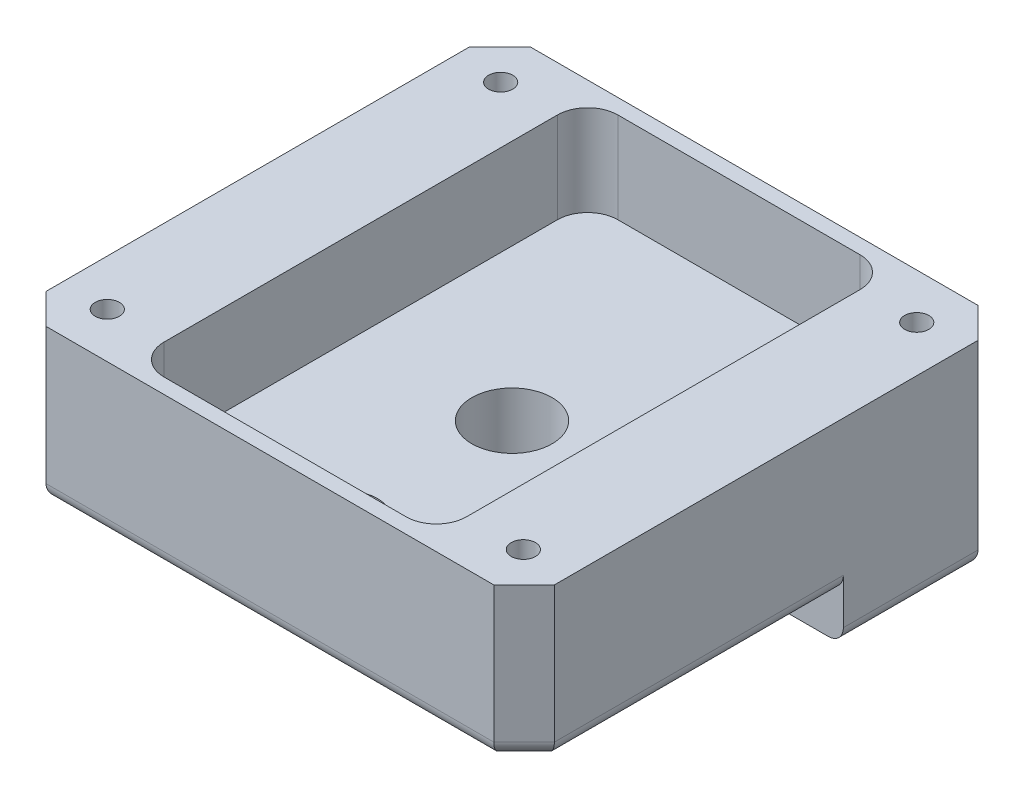
ISO-10303-21;
HEADER;
FILE_DESCRIPTION(('STEP AP214'),'2;1');
FILE_NAME('part.step','',(''),(''),'','','');
FILE_SCHEMA(('AUTOMOTIVE_DESIGN { 1 0 10303 214 1 1 1 1 }'));
ENDSEC;
DATA;
#1=APPLICATION_CONTEXT('core data for automotive mechanical design processes');
#2=APPLICATION_PROTOCOL_DEFINITION('international standard','automotive_design',2000,#1);
#3=PRODUCT_CONTEXT('',#1,'mechanical');
#4=PRODUCT('Part','Part','',(#3));
#5=PRODUCT_RELATED_PRODUCT_CATEGORY('part','',(#4));
#6=PRODUCT_DEFINITION_FORMATION('','',#4);
#7=PRODUCT_DEFINITION_CONTEXT('part definition',#1,'design');
#8=PRODUCT_DEFINITION('design','',#6,#7);
#9=PRODUCT_DEFINITION_SHAPE('','',#8);
#10=(LENGTH_UNIT() NAMED_UNIT(*) SI_UNIT(.MILLI.,.METRE.));
#11=(NAMED_UNIT(*) PLANE_ANGLE_UNIT() SI_UNIT($,.RADIAN.));
#12=(NAMED_UNIT(*) SI_UNIT($,.STERADIAN.) SOLID_ANGLE_UNIT());
#13=UNCERTAINTY_MEASURE_WITH_UNIT(LENGTH_MEASURE(1.E-05),#10,'distance_accuracy_value','');
#14=(GEOMETRIC_REPRESENTATION_CONTEXT(3) GLOBAL_UNCERTAINTY_ASSIGNED_CONTEXT((#13)) GLOBAL_UNIT_ASSIGNED_CONTEXT((#10,
#11,#12)) REPRESENTATION_CONTEXT('',''));
#15=CARTESIAN_POINT('',(0.,0.,0.));
#16=DIRECTION('',(0.,0.,1.));
#17=DIRECTION('',(1.,0.,0.));
#18=AXIS2_PLACEMENT_3D('',#15,#16,#17);
#19=CARTESIAN_POINT('',(-16.8,13.,-16.));
#20=DIRECTION('',(1.,0.,0.));
#21=DIRECTION('',(0.,0.,-1.));
#22=AXIS2_PLACEMENT_3D('',#19,#20,#21);
#23=PLANE('',#22);
#24=DIRECTION('',(0.,-1.,0.));
#25=VECTOR('',#24,1.);
#26=CARTESIAN_POINT('',(-16.8,3.,-5.1));
#27=LINE('',#26,#25);
#28=CARTESIAN_POINT('',(-16.8,4.,-5.1));
#29=VERTEX_POINT('',#28);
#30=CARTESIAN_POINT('',(-16.8,0.999999999999999,-5.1));
#31=VERTEX_POINT('',#30);
#32=EDGE_CURVE('E53',#29,#31,#27,.T.);
#33=ORIENTED_EDGE('',*,*,#32,.F.);
#34=DIRECTION('',(0.,0.,-1.));
#35=VECTOR('',#34,1.);
#36=CARTESIAN_POINT('',(-16.8,4.,-16.));
#37=LINE('',#36,#35);
#38=CARTESIAN_POINT('',(-16.8,4.,14.));
#39=VERTEX_POINT('',#38);
#40=EDGE_CURVE('E382',#29,#39,#37,.F.);
#41=ORIENTED_EDGE('',*,*,#40,.T.);
#42=DIRECTION('',(0.,1.,0.));
#43=VECTOR('',#42,1.);
#44=CARTESIAN_POINT('',(-16.8,13.,14.));
#45=LINE('',#44,#43);
#46=CARTESIAN_POINT('',(-16.8,13.,14.));
#47=VERTEX_POINT('',#46);
#48=EDGE_CURVE('E320',#39,#47,#45,.T.);
#49=ORIENTED_EDGE('',*,*,#48,.T.);
#50=DIRECTION('',(0.,0.,1.));
#51=VECTOR('',#50,1.);
#52=CARTESIAN_POINT('',(-16.8,13.,-16.));
#53=LINE('',#52,#51);
#54=CARTESIAN_POINT('',(-16.8,13.,-14.));
#55=VERTEX_POINT('',#54);
#56=EDGE_CURVE('E250',#55,#47,#53,.T.);
#57=ORIENTED_EDGE('',*,*,#56,.F.);
#58=DIRECTION('',(0.,-1.,0.));
#59=VECTOR('',#58,1.);
#60=CARTESIAN_POINT('',(-16.8,13.,-14.));
#61=LINE('',#60,#59);
#62=CARTESIAN_POINT('',(-16.8,0.999999999999999,-14.));
#63=VERTEX_POINT('',#62);
#64=EDGE_CURVE('E318',#55,#63,#61,.T.);
#65=ORIENTED_EDGE('',*,*,#64,.T.);
#66=DIRECTION('',(0.,0.,1.));
#67=VECTOR('',#66,1.);
#68=CARTESIAN_POINT('',(-16.8,0.999999999999999,-16.));
#69=LINE('',#68,#67);
#70=EDGE_CURVE('E57',#63,#31,#69,.T.);
#71=ORIENTED_EDGE('',*,*,#70,.T.);
#72=EDGE_LOOP('',(#33,#41,#49,#57,#65,#71));
#73=FACE_BOUND('',#72,.T.);
#74=ADVANCED_FACE('F36',(#73),#23,.F.);
#75=CARTESIAN_POINT('',(-16.8,13.,16.));
#76=DIRECTION('',(0.,0.,-1.));
#77=DIRECTION('',(-1.,0.,0.));
#78=AXIS2_PLACEMENT_3D('',#75,#76,#77);
#79=PLANE('',#78);
#80=DIRECTION('',(0.,-1.,0.));
#81=VECTOR('',#80,1.);
#82=CARTESIAN_POINT('',(-14.8,13.,16.));
#83=LINE('',#82,#81);
#84=CARTESIAN_POINT('',(-14.8,13.,16.));
#85=VERTEX_POINT('',#84);
#86=CARTESIAN_POINT('',(-14.8,4.,16.));
#87=VERTEX_POINT('',#86);
#88=EDGE_CURVE('E315',#85,#87,#83,.T.);
#89=ORIENTED_EDGE('',*,*,#88,.T.);
#90=DIRECTION('',(-1.,0.,0.));
#91=VECTOR('',#90,1.);
#92=CARTESIAN_POINT('',(-16.8,4.,16.));
#93=LINE('',#92,#91);
#94=CARTESIAN_POINT('',(14.8,4.,16.));
#95=VERTEX_POINT('',#94);
#96=EDGE_CURVE('E379',#87,#95,#93,.F.);
#97=ORIENTED_EDGE('',*,*,#96,.T.);
#98=DIRECTION('',(0.,1.,0.));
#99=VECTOR('',#98,1.);
#100=CARTESIAN_POINT('',(14.8,13.,16.));
#101=LINE('',#100,#99);
#102=CARTESIAN_POINT('',(14.8,13.,16.));
#103=VERTEX_POINT('',#102);
#104=EDGE_CURVE('E308',#95,#103,#101,.T.);
#105=ORIENTED_EDGE('',*,*,#104,.T.);
#106=DIRECTION('',(1.,0.,0.));
#107=VECTOR('',#106,1.);
#108=CARTESIAN_POINT('',(-16.8,13.,16.));
#109=LINE('',#108,#107);
#110=EDGE_CURVE('E263',#85,#103,#109,.T.);
#111=ORIENTED_EDGE('',*,*,#110,.F.);
#112=EDGE_LOOP('',(#89,#97,#105,#111));
#113=FACE_BOUND('',#112,.T.);
#114=ADVANCED_FACE('F463',(#113),#79,.F.);
#115=CARTESIAN_POINT('',(16.8,13.,-16.));
#116=DIRECTION('',(-1.,0.,0.));
#117=DIRECTION('',(0.,0.,1.));
#118=AXIS2_PLACEMENT_3D('',#115,#116,#117);
#119=PLANE('',#118);
#120=DIRECTION('',(0.,-1.,0.));
#121=VECTOR('',#120,1.);
#122=CARTESIAN_POINT('',(16.8,3.,-5.1));
#123=LINE('',#122,#121);
#124=CARTESIAN_POINT('',(16.8,4.,-5.1));
#125=VERTEX_POINT('',#124);
#126=CARTESIAN_POINT('',(16.8,0.999999999999999,-5.1));
#127=VERTEX_POINT('',#126);
#128=EDGE_CURVE('E313',#125,#127,#123,.T.);
#129=ORIENTED_EDGE('',*,*,#128,.T.);
#130=DIRECTION('',(0.,0.,-1.));
#131=VECTOR('',#130,1.);
#132=CARTESIAN_POINT('',(16.8,0.999999999999999,-16.));
#133=LINE('',#132,#131);
#134=CARTESIAN_POINT('',(16.8,0.999999999999999,-14.));
#135=VERTEX_POINT('',#134);
#136=EDGE_CURVE('E373',#127,#135,#133,.T.);
#137=ORIENTED_EDGE('',*,*,#136,.T.);
#138=DIRECTION('',(0.,1.,0.));
#139=VECTOR('',#138,1.);
#140=CARTESIAN_POINT('',(16.8,13.,-14.));
#141=LINE('',#140,#139);
#142=CARTESIAN_POINT('',(16.8,13.,-14.));
#143=VERTEX_POINT('',#142);
#144=EDGE_CURVE('E330',#135,#143,#141,.T.);
#145=ORIENTED_EDGE('',*,*,#144,.T.);
#146=DIRECTION('',(0.,0.,-1.));
#147=VECTOR('',#146,1.);
#148=CARTESIAN_POINT('',(16.8,13.,-16.));
#149=LINE('',#148,#147);
#150=CARTESIAN_POINT('',(16.8,13.,14.));
#151=VERTEX_POINT('',#150);
#152=EDGE_CURVE('E266',#151,#143,#149,.T.);
#153=ORIENTED_EDGE('',*,*,#152,.F.);
#154=DIRECTION('',(0.,-1.,0.));
#155=VECTOR('',#154,1.);
#156=CARTESIAN_POINT('',(16.8,13.,14.));
#157=LINE('',#156,#155);
#158=CARTESIAN_POINT('',(16.8,4.,14.));
#159=VERTEX_POINT('',#158);
#160=EDGE_CURVE('E332',#151,#159,#157,.T.);
#161=ORIENTED_EDGE('',*,*,#160,.T.);
#162=DIRECTION('',(0.,0.,1.));
#163=VECTOR('',#162,1.);
#164=CARTESIAN_POINT('',(16.8,4.,-16.));
#165=LINE('',#164,#163);
#166=EDGE_CURVE('E370',#159,#125,#165,.F.);
#167=ORIENTED_EDGE('',*,*,#166,.T.);
#168=EDGE_LOOP('',(#129,#137,#145,#153,#161,#167));
#169=FACE_BOUND('',#168,.T.);
#170=ADVANCED_FACE('F468',(#169),#119,.F.);
#171=CARTESIAN_POINT('',(-16.8,13.,-16.));
#172=DIRECTION('',(0.,0.,1.));
#173=DIRECTION('',(1.,0.,0.));
#174=AXIS2_PLACEMENT_3D('',#171,#172,#173);
#175=PLANE('',#174);
#176=DIRECTION('',(0.,-1.,0.));
#177=VECTOR('',#176,1.);
#178=CARTESIAN_POINT('',(14.8,13.,-16.));
#179=LINE('',#178,#177);
#180=CARTESIAN_POINT('',(14.8,13.,-16.));
#181=VERTEX_POINT('',#180);
#182=CARTESIAN_POINT('',(14.8,0.999999999999999,-16.));
#183=VERTEX_POINT('',#182);
#184=EDGE_CURVE('E337',#181,#183,#179,.T.);
#185=ORIENTED_EDGE('',*,*,#184,.T.);
#186=DIRECTION('',(-1.,0.,0.));
#187=VECTOR('',#186,1.);
#188=CARTESIAN_POINT('',(-16.8,0.999999999999999,-16.));
#189=LINE('',#188,#187);
#190=CARTESIAN_POINT('',(-14.8,0.999999999999999,-16.));
#191=VERTEX_POINT('',#190);
#192=EDGE_CURVE('E384',#183,#191,#189,.T.);
#193=ORIENTED_EDGE('',*,*,#192,.T.);
#194=DIRECTION('',(0.,1.,0.));
#195=VECTOR('',#194,1.);
#196=CARTESIAN_POINT('',(-14.8,13.,-16.));
#197=LINE('',#196,#195);
#198=CARTESIAN_POINT('',(-14.8,13.,-16.));
#199=VERTEX_POINT('',#198);
#200=EDGE_CURVE('E335',#191,#199,#197,.T.);
#201=ORIENTED_EDGE('',*,*,#200,.T.);
#202=DIRECTION('',(-1.,0.,0.));
#203=VECTOR('',#202,1.);
#204=CARTESIAN_POINT('',(-16.8,13.,-16.));
#205=LINE('',#204,#203);
#206=EDGE_CURVE('E269',#181,#199,#205,.T.);
#207=ORIENTED_EDGE('',*,*,#206,.F.);
#208=EDGE_LOOP('',(#185,#193,#201,#207));
#209=FACE_BOUND('',#208,.T.);
#210=ADVANCED_FACE('F622',(#209),#175,.F.);
#211=CARTESIAN_POINT('',(0.,13.,0.));
#212=DIRECTION('',(0.,1.,0.));
#213=DIRECTION('',(0.,0.,1.));
#214=AXIS2_PLACEMENT_3D('',#211,#212,#213);
#215=PLANE('',#214);
#216=CARTESIAN_POINT('',(-13.75,13.,-13.));
#217=DIRECTION('',(0.,1.,0.));
#218=DIRECTION('',(0.,0.,1.));
#219=AXIS2_PLACEMENT_3D('',#216,#217,#218);
#220=CIRCLE('',#219,0.799999999999988);
#221=CARTESIAN_POINT('',(-13.75,13.,-12.2));
#222=VERTEX_POINT('',#221);
#223=EDGE_CURVE('E212',#222,#222,#220,.T.);
#224=ORIENTED_EDGE('',*,*,#223,.F.);
#225=EDGE_LOOP('',(#224));
#226=FACE_BOUND('',#225,.T.);
#227=CARTESIAN_POINT('',(13.75,13.,-13.));
#228=DIRECTION('',(0.,1.,0.));
#229=DIRECTION('',(0.,0.,1.));
#230=AXIS2_PLACEMENT_3D('',#227,#228,#229);
#231=CIRCLE('',#230,0.799999999999988);
#232=CARTESIAN_POINT('',(13.75,13.,-12.2));
#233=VERTEX_POINT('',#232);
#234=EDGE_CURVE('E224',#233,#233,#231,.T.);
#235=ORIENTED_EDGE('',*,*,#234,.F.);
#236=EDGE_LOOP('',(#235));
#237=FACE_BOUND('',#236,.T.);
#238=CARTESIAN_POINT('',(13.75,13.,13.));
#239=DIRECTION('',(0.,1.,0.));
#240=DIRECTION('',(0.,0.,1.));
#241=AXIS2_PLACEMENT_3D('',#238,#239,#240);
#242=CIRCLE('',#241,0.799999999999988);
#243=CARTESIAN_POINT('',(13.75,13.,13.8));
#244=VERTEX_POINT('',#243);
#245=EDGE_CURVE('E230',#244,#244,#242,.T.);
#246=ORIENTED_EDGE('',*,*,#245,.F.);
#247=EDGE_LOOP('',(#246));
#248=FACE_BOUND('',#247,.T.);
#249=CARTESIAN_POINT('',(-13.75,13.,13.));
#250=DIRECTION('',(0.,1.,0.));
#251=DIRECTION('',(0.,0.,1.));
#252=AXIS2_PLACEMENT_3D('',#249,#250,#251);
#253=CIRCLE('',#252,0.799999999999988);
#254=CARTESIAN_POINT('',(-13.75,13.,13.8));
#255=VERTEX_POINT('',#254);
#256=EDGE_CURVE('E233',#255,#255,#253,.T.);
#257=ORIENTED_EDGE('',*,*,#256,.F.);
#258=EDGE_LOOP('',(#257));
#259=FACE_BOUND('',#258,.T.);
#260=DIRECTION('',(0.,0.,1.));
#261=VECTOR('',#260,1.);
#262=CARTESIAN_POINT('',(-10.,13.,-15.));
#263=LINE('',#262,#261);
#264=CARTESIAN_POINT('',(-10.,13.,-13.));
#265=VERTEX_POINT('',#264);
#266=CARTESIAN_POINT('',(-10.,13.,13.));
#267=VERTEX_POINT('',#266);
#268=EDGE_CURVE('E236',#265,#267,#263,.T.);
#269=ORIENTED_EDGE('',*,*,#268,.F.);
#270=CARTESIAN_POINT('',(-8.,13.,-13.));
#271=DIRECTION('',(0.,1.,0.));
#272=DIRECTION('',(0.,0.,1.));
#273=AXIS2_PLACEMENT_3D('',#270,#271,#272);
#274=CIRCLE('',#273,2.);
#275=CARTESIAN_POINT('',(-8.,13.,-15.));
#276=VERTEX_POINT('',#275);
#277=EDGE_CURVE('E306',#265,#276,#274,.F.);
#278=ORIENTED_EDGE('',*,*,#277,.T.);
#279=DIRECTION('',(-1.,0.,0.));
#280=VECTOR('',#279,1.);
#281=CARTESIAN_POINT('',(-10.,13.,-15.));
#282=LINE('',#281,#280);
#283=CARTESIAN_POINT('',(8.,13.,-15.));
#284=VERTEX_POINT('',#283);
#285=EDGE_CURVE('E241',#284,#276,#282,.T.);
#286=ORIENTED_EDGE('',*,*,#285,.F.);
#287=CARTESIAN_POINT('',(8.,13.,-13.));
#288=DIRECTION('',(0.,1.,0.));
#289=DIRECTION('',(0.,0.,1.));
#290=AXIS2_PLACEMENT_3D('',#287,#288,#289);
#291=CIRCLE('',#290,2.);
#292=CARTESIAN_POINT('',(10.,13.,-13.));
#293=VERTEX_POINT('',#292);
#294=EDGE_CURVE('E302',#284,#293,#291,.F.);
#295=ORIENTED_EDGE('',*,*,#294,.T.);
#296=DIRECTION('',(0.,0.,-1.));
#297=VECTOR('',#296,1.);
#298=CARTESIAN_POINT('',(10.,13.,-15.));
#299=LINE('',#298,#297);
#300=CARTESIAN_POINT('',(10.,13.,13.));
#301=VERTEX_POINT('',#300);
#302=EDGE_CURVE('E256',#301,#293,#299,.T.);
#303=ORIENTED_EDGE('',*,*,#302,.F.);
#304=CARTESIAN_POINT('',(8.,13.,13.));
#305=DIRECTION('',(0.,1.,0.));
#306=DIRECTION('',(0.,0.,1.));
#307=AXIS2_PLACEMENT_3D('',#304,#305,#306);
#308=CIRCLE('',#307,2.);
#309=CARTESIAN_POINT('',(8.,13.,15.));
#310=VERTEX_POINT('',#309);
#311=EDGE_CURVE('E304',#301,#310,#308,.F.);
#312=ORIENTED_EDGE('',*,*,#311,.T.);
#313=DIRECTION('',(1.,0.,0.));
#314=VECTOR('',#313,1.);
#315=CARTESIAN_POINT('',(-10.,13.,15.));
#316=LINE('',#315,#314);
#317=CARTESIAN_POINT('',(-8.,13.,15.));
#318=VERTEX_POINT('',#317);
#319=EDGE_CURVE('E253',#318,#310,#316,.T.);
#320=ORIENTED_EDGE('',*,*,#319,.F.);
#321=CARTESIAN_POINT('',(-8.,13.,13.));
#322=DIRECTION('',(0.,1.,0.));
#323=DIRECTION('',(0.,0.,1.));
#324=AXIS2_PLACEMENT_3D('',#321,#322,#323);
#325=CIRCLE('',#324,2.);
#326=EDGE_CURVE('E300',#318,#267,#325,.F.);
#327=ORIENTED_EDGE('',*,*,#326,.T.);
#328=EDGE_LOOP('',(#269,#278,#286,#295,#303,#312,#320,#327));
#329=FACE_BOUND('',#328,.T.);
#330=ORIENTED_EDGE('',*,*,#56,.T.);
#331=DIRECTION('',(-0.707106781186546,0.,-0.707106781186549));
#332=VECTOR('',#331,1.);
#333=CARTESIAN_POINT('',(-15.4,13.,15.4));
#334=LINE('',#333,#332);
#335=EDGE_CURVE('E328',#47,#85,#334,.F.);
#336=ORIENTED_EDGE('',*,*,#335,.T.);
#337=ORIENTED_EDGE('',*,*,#110,.T.);
#338=DIRECTION('',(-0.70710678118655,0.,0.707106781186545));
#339=VECTOR('',#338,1.);
#340=CARTESIAN_POINT('',(15.3999999999999,13.,15.4));
#341=LINE('',#340,#339);
#342=EDGE_CURVE('E326',#103,#151,#341,.F.);
#343=ORIENTED_EDGE('',*,*,#342,.T.);
#344=ORIENTED_EDGE('',*,*,#152,.T.);
#345=DIRECTION('',(0.707106781186548,0.,0.707106781186548));
#346=VECTOR('',#345,1.);
#347=CARTESIAN_POINT('',(15.4,13.,-15.4));
#348=LINE('',#347,#346);
#349=EDGE_CURVE('E324',#143,#181,#348,.F.);
#350=ORIENTED_EDGE('',*,*,#349,.T.);
#351=ORIENTED_EDGE('',*,*,#206,.T.);
#352=DIRECTION('',(0.707106781186549,0.,-0.707106781186546));
#353=VECTOR('',#352,1.);
#354=CARTESIAN_POINT('',(-15.4,13.,-15.4));
#355=LINE('',#354,#353);
#356=EDGE_CURVE('E322',#199,#55,#355,.F.);
#357=ORIENTED_EDGE('',*,*,#356,.T.);
#358=EDGE_LOOP('',(#330,#336,#337,#343,#344,#350,#351,#357));
#359=FACE_BOUND('',#358,.T.);
#360=ADVANCED_FACE('F612',(#226,#237,#248,#259,#329,#359),#215,.T.);
#361=CARTESIAN_POINT('',(0.,0.,0.));
#362=DIRECTION('',(0.,1.,0.));
#363=DIRECTION('',(0.,0.,1.));
#364=AXIS2_PLACEMENT_3D('',#361,#362,#363);
#365=PLANE('',#364);
#366=CARTESIAN_POINT('',(-13.75,0.,-13.));
#367=DIRECTION('',(0.,1.,0.));
#368=DIRECTION('',(0.,0.,1.));
#369=AXIS2_PLACEMENT_3D('',#366,#367,#368);
#370=CIRCLE('',#369,0.799999999999997);
#371=CARTESIAN_POINT('',(-13.75,0.,-12.2));
#372=VERTEX_POINT('',#371);
#373=EDGE_CURVE('E221',#372,#372,#370,.T.);
#374=ORIENTED_EDGE('',*,*,#373,.T.);
#375=EDGE_LOOP('',(#374));
#376=FACE_BOUND('',#375,.T.);
#377=CARTESIAN_POINT('',(13.75,0.,-13.));
#378=DIRECTION('',(0.,1.,0.));
#379=DIRECTION('',(0.,0.,1.));
#380=AXIS2_PLACEMENT_3D('',#377,#378,#379);
#381=CIRCLE('',#380,0.799999999999997);
#382=CARTESIAN_POINT('',(13.75,0.,-12.2));
#383=VERTEX_POINT('',#382);
#384=EDGE_CURVE('E227',#383,#383,#381,.T.);
#385=ORIENTED_EDGE('',*,*,#384,.T.);
#386=EDGE_LOOP('',(#385));
#387=FACE_BOUND('',#386,.T.);
#388=DIRECTION('',(-0.707106781186548,0.,-0.707106781186548));
#389=VECTOR('',#388,1.);
#390=CARTESIAN_POINT('',(16.0928932188135,0.,-13.2928932188134));
#391=LINE('',#390,#389);
#392=CARTESIAN_POINT('',(14.3857864376269,0.,-15.));
#393=VERTEX_POINT('',#392);
#394=CARTESIAN_POINT('',(15.8,0.,-13.5857864376269));
#395=VERTEX_POINT('',#394);
#396=EDGE_CURVE('E357',#393,#395,#391,.F.);
#397=ORIENTED_EDGE('',*,*,#396,.T.);
#398=DIRECTION('',(0.,0.,-1.));
#399=VECTOR('',#398,1.);
#400=CARTESIAN_POINT('',(15.8,0.,0.));
#401=LINE('',#400,#399);
#402=CARTESIAN_POINT('',(15.8,0.,-5.1));
#403=VERTEX_POINT('',#402);
#404=EDGE_CURVE('E364',#395,#403,#401,.F.);
#405=ORIENTED_EDGE('',*,*,#404,.T.);
#406=DIRECTION('',(1.,0.,0.));
#407=VECTOR('',#406,1.);
#408=CARTESIAN_POINT('',(-16.8,0.,-5.1));
#409=LINE('',#408,#407);
#410=CARTESIAN_POINT('',(-15.8,0.,-5.1));
#411=VERTEX_POINT('',#410);
#412=EDGE_CURVE('E398',#411,#403,#409,.T.);
#413=ORIENTED_EDGE('',*,*,#412,.F.);
#414=DIRECTION('',(0.,0.,1.));
#415=VECTOR('',#414,1.);
#416=CARTESIAN_POINT('',(-15.8,0.,0.));
#417=LINE('',#416,#415);
#418=CARTESIAN_POINT('',(-15.8,0.,-13.5857864376269));
#419=VERTEX_POINT('',#418);
#420=EDGE_CURVE('E362',#411,#419,#417,.F.);
#421=ORIENTED_EDGE('',*,*,#420,.T.);
#422=DIRECTION('',(-0.707106781186549,0.,0.707106781186546));
#423=VECTOR('',#422,1.);
#424=CARTESIAN_POINT('',(-14.0928932188135,0.,-15.2928932188135));
#425=LINE('',#424,#423);
#426=CARTESIAN_POINT('',(-14.3857864376269,0.,-15.));
#427=VERTEX_POINT('',#426);
#428=EDGE_CURVE('E359',#419,#427,#425,.F.);
#429=ORIENTED_EDGE('',*,*,#428,.T.);
#430=DIRECTION('',(-1.,0.,0.));
#431=VECTOR('',#430,1.);
#432=CARTESIAN_POINT('',(0.,0.,-15.));
#433=LINE('',#432,#431);
#434=EDGE_CURVE('E355',#427,#393,#433,.F.);
#435=ORIENTED_EDGE('',*,*,#434,.T.);
#436=EDGE_LOOP('',(#397,#405,#413,#421,#429,#435));
#437=FACE_BOUND('',#436,.T.);
#438=ADVANCED_FACE('F422',(#376,#387,#437),#365,.F.);
#439=CARTESIAN_POINT('',(-10.,7.,-15.));
#440=DIRECTION('',(-1.,0.,0.));
#441=DIRECTION('',(0.,0.,1.));
#442=AXIS2_PLACEMENT_3D('',#439,#440,#441);
#443=PLANE('',#442);
#444=ORIENTED_EDGE('',*,*,#268,.T.);
#445=DIRECTION('',(0.,1.,0.));
#446=VECTOR('',#445,1.);
#447=CARTESIAN_POINT('',(-10.,7.,13.));
#448=LINE('',#447,#446);
#449=CARTESIAN_POINT('',(-10.,7.,13.));
#450=VERTEX_POINT('',#449);
#451=EDGE_CURVE('E280',#267,#450,#448,.F.);
#452=ORIENTED_EDGE('',*,*,#451,.T.);
#453=DIRECTION('',(0.,0.,1.));
#454=VECTOR('',#453,1.);
#455=CARTESIAN_POINT('',(-10.,7.,-15.));
#456=LINE('',#455,#454);
#457=CARTESIAN_POINT('',(-10.,7.,-13.));
#458=VERTEX_POINT('',#457);
#459=EDGE_CURVE('E237',#458,#450,#456,.T.);
#460=ORIENTED_EDGE('',*,*,#459,.F.);
#461=DIRECTION('',(0.,1.,0.));
#462=VECTOR('',#461,1.);
#463=CARTESIAN_POINT('',(-10.,13.,-13.));
#464=LINE('',#463,#462);
#465=EDGE_CURVE('E277',#458,#265,#464,.T.);
#466=ORIENTED_EDGE('',*,*,#465,.T.);
#467=EDGE_LOOP('',(#444,#452,#460,#466));
#468=FACE_BOUND('',#467,.T.);
#469=ADVANCED_FACE('F611',(#468),#443,.F.);
#470=CARTESIAN_POINT('',(-10.,7.,-15.));
#471=DIRECTION('',(0.,0.,-1.));
#472=DIRECTION('',(-1.,0.,0.));
#473=AXIS2_PLACEMENT_3D('',#470,#471,#472);
#474=PLANE('',#473);
#475=DIRECTION('',(-1.,0.,0.));
#476=VECTOR('',#475,1.);
#477=CARTESIAN_POINT('',(-10.,7.,-15.));
#478=LINE('',#477,#476);
#479=CARTESIAN_POINT('',(8.,7.,-15.));
#480=VERTEX_POINT('',#479);
#481=CARTESIAN_POINT('',(-8.,7.,-15.));
#482=VERTEX_POINT('',#481);
#483=EDGE_CURVE('E247',#480,#482,#478,.T.);
#484=ORIENTED_EDGE('',*,*,#483,.F.);
#485=DIRECTION('',(0.,1.,0.));
#486=VECTOR('',#485,1.);
#487=CARTESIAN_POINT('',(8.,13.,-15.));
#488=LINE('',#487,#486);
#489=EDGE_CURVE('E292',#480,#284,#488,.T.);
#490=ORIENTED_EDGE('',*,*,#489,.T.);
#491=ORIENTED_EDGE('',*,*,#285,.T.);
#492=DIRECTION('',(0.,1.,0.));
#493=VECTOR('',#492,1.);
#494=CARTESIAN_POINT('',(-8.,7.,-15.));
#495=LINE('',#494,#493);
#496=EDGE_CURVE('E290',#276,#482,#495,.F.);
#497=ORIENTED_EDGE('',*,*,#496,.T.);
#498=EDGE_LOOP('',(#484,#490,#491,#497));
#499=FACE_BOUND('',#498,.T.);
#500=ADVANCED_FACE('F659',(#499),#474,.F.);
#501=CARTESIAN_POINT('',(10.,7.,-15.));
#502=DIRECTION('',(1.,0.,0.));
#503=DIRECTION('',(0.,0.,-1.));
#504=AXIS2_PLACEMENT_3D('',#501,#502,#503);
#505=PLANE('',#504);
#506=ORIENTED_EDGE('',*,*,#302,.T.);
#507=DIRECTION('',(0.,1.,0.));
#508=VECTOR('',#507,1.);
#509=CARTESIAN_POINT('',(10.,7.,-13.));
#510=LINE('',#509,#508);
#511=CARTESIAN_POINT('',(10.,7.,-13.));
#512=VERTEX_POINT('',#511);
#513=EDGE_CURVE('E298',#293,#512,#510,.F.);
#514=ORIENTED_EDGE('',*,*,#513,.T.);
#515=DIRECTION('',(0.,0.,-1.));
#516=VECTOR('',#515,1.);
#517=CARTESIAN_POINT('',(10.,7.,-15.));
#518=LINE('',#517,#516);
#519=CARTESIAN_POINT('',(10.,7.,13.));
#520=VERTEX_POINT('',#519);
#521=EDGE_CURVE('E244',#520,#512,#518,.T.);
#522=ORIENTED_EDGE('',*,*,#521,.F.);
#523=DIRECTION('',(0.,1.,0.));
#524=VECTOR('',#523,1.);
#525=CARTESIAN_POINT('',(10.,13.,13.));
#526=LINE('',#525,#524);
#527=EDGE_CURVE('E295',#520,#301,#526,.T.);
#528=ORIENTED_EDGE('',*,*,#527,.T.);
#529=EDGE_LOOP('',(#506,#514,#522,#528));
#530=FACE_BOUND('',#529,.T.);
#531=ADVANCED_FACE('F665',(#530),#505,.F.);
#532=CARTESIAN_POINT('',(-10.,7.,15.));
#533=DIRECTION('',(0.,0.,1.));
#534=DIRECTION('',(1.,0.,0.));
#535=AXIS2_PLACEMENT_3D('',#532,#533,#534);
#536=PLANE('',#535);
#537=DIRECTION('',(1.,0.,0.));
#538=VECTOR('',#537,1.);
#539=CARTESIAN_POINT('',(-10.,7.,15.));
#540=LINE('',#539,#538);
#541=CARTESIAN_POINT('',(-8.,7.,15.));
#542=VERTEX_POINT('',#541);
#543=CARTESIAN_POINT('',(8.,7.,15.));
#544=VERTEX_POINT('',#543);
#545=EDGE_CURVE('E240',#542,#544,#540,.T.);
#546=ORIENTED_EDGE('',*,*,#545,.F.);
#547=DIRECTION('',(0.,1.,0.));
#548=VECTOR('',#547,1.);
#549=CARTESIAN_POINT('',(-8.,13.,15.));
#550=LINE('',#549,#548);
#551=EDGE_CURVE('E274',#542,#318,#550,.T.);
#552=ORIENTED_EDGE('',*,*,#551,.T.);
#553=ORIENTED_EDGE('',*,*,#319,.T.);
#554=DIRECTION('',(0.,1.,0.));
#555=VECTOR('',#554,1.);
#556=CARTESIAN_POINT('',(8.,7.,15.));
#557=LINE('',#556,#555);
#558=EDGE_CURVE('E272',#310,#544,#557,.F.);
#559=ORIENTED_EDGE('',*,*,#558,.T.);
#560=EDGE_LOOP('',(#546,#552,#553,#559));
#561=FACE_BOUND('',#560,.T.);
#562=ADVANCED_FACE('F661',(#561),#536,.F.);
#563=CARTESIAN_POINT('',(0.,7.,0.));
#564=DIRECTION('',(0.,1.,0.));
#565=DIRECTION('',(0.,0.,1.));
#566=AXIS2_PLACEMENT_3D('',#563,#564,#565);
#567=PLANE('',#566);
#568=CARTESIAN_POINT('',(0.,7.,11.));
#569=DIRECTION('',(0.,1.,0.));
#570=DIRECTION('',(0.,0.,1.));
#571=AXIS2_PLACEMENT_3D('',#568,#569,#570);
#572=CIRCLE('',#571,2.1);
#573=CARTESIAN_POINT('',(0.,7.,13.1));
#574=VERTEX_POINT('',#573);
#575=EDGE_CURVE('E209',#574,#574,#572,.T.);
#576=ORIENTED_EDGE('',*,*,#575,.F.);
#577=EDGE_LOOP('',(#576));
#578=FACE_BOUND('',#577,.T.);
#579=CARTESIAN_POINT('',(0.,7.,0.));
#580=DIRECTION('',(0.,1.,0.));
#581=DIRECTION('',(0.,0.,1.));
#582=AXIS2_PLACEMENT_3D('',#579,#580,#581);
#583=CIRCLE('',#582,2.65);
#584=CARTESIAN_POINT('',(0.,7.,2.65));
#585=VERTEX_POINT('',#584);
#586=EDGE_CURVE('E208',#585,#585,#583,.T.);
#587=ORIENTED_EDGE('',*,*,#586,.F.);
#588=EDGE_LOOP('',(#587));
#589=FACE_BOUND('',#588,.T.);
#590=ORIENTED_EDGE('',*,*,#459,.T.);
#591=CARTESIAN_POINT('',(-8.,7.,13.));
#592=DIRECTION('',(0.,1.,0.));
#593=DIRECTION('',(0.,0.,1.));
#594=AXIS2_PLACEMENT_3D('',#591,#592,#593);
#595=CIRCLE('',#594,2.);
#596=EDGE_CURVE('E288',#450,#542,#595,.T.);
#597=ORIENTED_EDGE('',*,*,#596,.T.);
#598=ORIENTED_EDGE('',*,*,#545,.T.);
#599=CARTESIAN_POINT('',(8.,7.,13.));
#600=DIRECTION('',(0.,1.,0.));
#601=DIRECTION('',(0.,0.,1.));
#602=AXIS2_PLACEMENT_3D('',#599,#600,#601);
#603=CIRCLE('',#602,2.);
#604=EDGE_CURVE('E284',#544,#520,#603,.T.);
#605=ORIENTED_EDGE('',*,*,#604,.T.);
#606=ORIENTED_EDGE('',*,*,#521,.T.);
#607=CARTESIAN_POINT('',(8.,7.,-13.));
#608=DIRECTION('',(0.,1.,0.));
#609=DIRECTION('',(0.,0.,1.));
#610=AXIS2_PLACEMENT_3D('',#607,#608,#609);
#611=CIRCLE('',#610,2.);
#612=EDGE_CURVE('E286',#512,#480,#611,.T.);
#613=ORIENTED_EDGE('',*,*,#612,.T.);
#614=ORIENTED_EDGE('',*,*,#483,.T.);
#615=CARTESIAN_POINT('',(-8.,7.,-13.));
#616=DIRECTION('',(0.,1.,0.));
#617=DIRECTION('',(0.,0.,1.));
#618=AXIS2_PLACEMENT_3D('',#615,#616,#617);
#619=CIRCLE('',#618,2.);
#620=EDGE_CURVE('E282',#482,#458,#619,.T.);
#621=ORIENTED_EDGE('',*,*,#620,.T.);
#622=EDGE_LOOP('',(#590,#597,#598,#605,#606,#613,#614,#621));
#623=FACE_BOUND('',#622,.T.);
#624=ADVANCED_FACE('F664',(#578,#589,#623),#567,.T.);
#625=CARTESIAN_POINT('',(-13.75,13.,13.));
#626=DIRECTION('',(0.,1.,0.));
#627=DIRECTION('',(0.,0.,1.));
#628=AXIS2_PLACEMENT_3D('',#625,#626,#627);
#629=CYLINDRICAL_SURFACE('',#628,0.799999999999993);
#630=CARTESIAN_POINT('',(-13.75,3.,13.));
#631=DIRECTION('',(0.,1.,0.));
#632=DIRECTION('',(0.,0.,1.));
#633=AXIS2_PLACEMENT_3D('',#630,#631,#632);
#634=CIRCLE('',#633,0.799999999999993);
#635=CARTESIAN_POINT('',(-13.75,3.,13.8));
#636=VERTEX_POINT('',#635);
#637=EDGE_CURVE('E215',#636,#636,#634,.F.);
#638=ORIENTED_EDGE('',*,*,#637,.T.);
#639=EDGE_LOOP('',(#638));
#640=FACE_BOUND('',#639,.T.);
#641=ORIENTED_EDGE('',*,*,#256,.T.);
#642=EDGE_LOOP('',(#641));
#643=FACE_BOUND('',#642,.T.);
#644=ADVANCED_FACE('F444',(#640,#643),#629,.F.);
#645=CARTESIAN_POINT('',(13.75,13.,13.));
#646=DIRECTION('',(0.,1.,0.));
#647=DIRECTION('',(0.,0.,1.));
#648=AXIS2_PLACEMENT_3D('',#645,#646,#647);
#649=CYLINDRICAL_SURFACE('',#648,0.799999999999993);
#650=CARTESIAN_POINT('',(13.75,3.,13.));
#651=DIRECTION('',(0.,1.,0.));
#652=DIRECTION('',(0.,0.,1.));
#653=AXIS2_PLACEMENT_3D('',#650,#651,#652);
#654=CIRCLE('',#653,0.799999999999993);
#655=CARTESIAN_POINT('',(13.75,3.,13.8));
#656=VERTEX_POINT('',#655);
#657=EDGE_CURVE('E439',#656,#656,#654,.F.);
#658=ORIENTED_EDGE('',*,*,#657,.T.);
#659=EDGE_LOOP('',(#658));
#660=FACE_BOUND('',#659,.T.);
#661=ORIENTED_EDGE('',*,*,#245,.T.);
#662=EDGE_LOOP('',(#661));
#663=FACE_BOUND('',#662,.T.);
#664=ADVANCED_FACE('F678',(#660,#663),#649,.F.);
#665=CARTESIAN_POINT('',(13.75,13.,-13.));
#666=DIRECTION('',(0.,1.,0.));
#667=DIRECTION('',(0.,0.,1.));
#668=AXIS2_PLACEMENT_3D('',#665,#666,#667);
#669=CYLINDRICAL_SURFACE('',#668,0.799999999999993);
#670=ORIENTED_EDGE('',*,*,#384,.F.);
#671=EDGE_LOOP('',(#670));
#672=FACE_BOUND('',#671,.T.);
#673=ORIENTED_EDGE('',*,*,#234,.T.);
#674=EDGE_LOOP('',(#673));
#675=FACE_BOUND('',#674,.T.);
#676=ADVANCED_FACE('F681',(#672,#675),#669,.F.);
#677=CARTESIAN_POINT('',(-13.75,13.,-13.));
#678=DIRECTION('',(0.,1.,0.));
#679=DIRECTION('',(0.,0.,1.));
#680=AXIS2_PLACEMENT_3D('',#677,#678,#679);
#681=CYLINDRICAL_SURFACE('',#680,0.799999999999993);
#682=ORIENTED_EDGE('',*,*,#373,.F.);
#683=EDGE_LOOP('',(#682));
#684=FACE_BOUND('',#683,.T.);
#685=ORIENTED_EDGE('',*,*,#223,.T.);
#686=EDGE_LOOP('',(#685));
#687=FACE_BOUND('',#686,.T.);
#688=ADVANCED_FACE('F477',(#684,#687),#681,.F.);
#689=CARTESIAN_POINT('',(-8.,7.,13.));
#690=DIRECTION('',(0.,-1.,0.));
#691=DIRECTION('',(0.,0.,-1.));
#692=AXIS2_PLACEMENT_3D('',#689,#690,#691);
#693=CYLINDRICAL_SURFACE('',#692,2.);
#694=ORIENTED_EDGE('',*,*,#596,.F.);
#695=ORIENTED_EDGE('',*,*,#451,.F.);
#696=ORIENTED_EDGE('',*,*,#326,.F.);
#697=ORIENTED_EDGE('',*,*,#551,.F.);
#698=EDGE_LOOP('',(#694,#695,#696,#697));
#699=FACE_BOUND('',#698,.T.);
#700=ADVANCED_FACE('F473',(#699),#693,.F.);
#701=CARTESIAN_POINT('',(8.,7.,-13.));
#702=DIRECTION('',(0.,-1.,0.));
#703=DIRECTION('',(0.,0.,-1.));
#704=AXIS2_PLACEMENT_3D('',#701,#702,#703);
#705=CYLINDRICAL_SURFACE('',#704,2.);
#706=ORIENTED_EDGE('',*,*,#612,.F.);
#707=ORIENTED_EDGE('',*,*,#513,.F.);
#708=ORIENTED_EDGE('',*,*,#294,.F.);
#709=ORIENTED_EDGE('',*,*,#489,.F.);
#710=EDGE_LOOP('',(#706,#707,#708,#709));
#711=FACE_BOUND('',#710,.T.);
#712=ADVANCED_FACE('F476',(#711),#705,.F.);
#713=CARTESIAN_POINT('',(8.,7.,13.));
#714=DIRECTION('',(0.,-1.,0.));
#715=DIRECTION('',(0.,0.,-1.));
#716=AXIS2_PLACEMENT_3D('',#713,#714,#715);
#717=CYLINDRICAL_SURFACE('',#716,2.);
#718=ORIENTED_EDGE('',*,*,#604,.F.);
#719=ORIENTED_EDGE('',*,*,#558,.F.);
#720=ORIENTED_EDGE('',*,*,#311,.F.);
#721=ORIENTED_EDGE('',*,*,#527,.F.);
#722=EDGE_LOOP('',(#718,#719,#720,#721));
#723=FACE_BOUND('',#722,.T.);
#724=ADVANCED_FACE('F481',(#723),#717,.F.);
#725=CARTESIAN_POINT('',(-8.,7.,-13.));
#726=DIRECTION('',(0.,-1.,0.));
#727=DIRECTION('',(0.,0.,-1.));
#728=AXIS2_PLACEMENT_3D('',#725,#726,#727);
#729=CYLINDRICAL_SURFACE('',#728,2.);
#730=ORIENTED_EDGE('',*,*,#620,.F.);
#731=ORIENTED_EDGE('',*,*,#496,.F.);
#732=ORIENTED_EDGE('',*,*,#277,.F.);
#733=ORIENTED_EDGE('',*,*,#465,.F.);
#734=EDGE_LOOP('',(#730,#731,#732,#733));
#735=FACE_BOUND('',#734,.T.);
#736=ADVANCED_FACE('F485',(#735),#729,.F.);
#737=CARTESIAN_POINT('',(0.,7.,0.));
#738=DIRECTION('',(0.,1.,0.));
#739=DIRECTION('',(0.,0.,1.));
#740=AXIS2_PLACEMENT_3D('',#737,#738,#739);
#741=CYLINDRICAL_SURFACE('',#740,2.65);
#742=CARTESIAN_POINT('',(0.,3.,0.));
#743=DIRECTION('',(0.,1.,0.));
#744=DIRECTION('',(0.,0.,1.));
#745=AXIS2_PLACEMENT_3D('',#742,#743,#744);
#746=CIRCLE('',#745,2.65);
#747=CARTESIAN_POINT('',(0.,3.,2.65));
#748=VERTEX_POINT('',#747);
#749=EDGE_CURVE('E436',#748,#748,#746,.F.);
#750=ORIENTED_EDGE('',*,*,#749,.T.);
#751=EDGE_LOOP('',(#750));
#752=FACE_BOUND('',#751,.T.);
#753=ORIENTED_EDGE('',*,*,#586,.T.);
#754=EDGE_LOOP('',(#753));
#755=FACE_BOUND('',#754,.T.);
#756=ADVANCED_FACE('F457',(#752,#755),#741,.F.);
#757=CARTESIAN_POINT('',(0.,0.,11.));
#758=DIRECTION('',(0.,-1.,0.));
#759=DIRECTION('',(0.,0.,-1.));
#760=AXIS2_PLACEMENT_3D('',#757,#758,#759);
#761=CYLINDRICAL_SURFACE('',#760,2.1);
#762=CARTESIAN_POINT('',(0.,3.,11.));
#763=DIRECTION('',(0.,1.,0.));
#764=DIRECTION('',(0.,0.,1.));
#765=AXIS2_PLACEMENT_3D('',#762,#763,#764);
#766=CIRCLE('',#765,2.1);
#767=CARTESIAN_POINT('',(0.,3.,13.1));
#768=VERTEX_POINT('',#767);
#769=EDGE_CURVE('E309',#768,#768,#766,.F.);
#770=ORIENTED_EDGE('',*,*,#769,.T.);
#771=EDGE_LOOP('',(#770));
#772=FACE_BOUND('',#771,.T.);
#773=ORIENTED_EDGE('',*,*,#575,.T.);
#774=EDGE_LOOP('',(#773));
#775=FACE_BOUND('',#774,.T.);
#776=ADVANCED_FACE('F449',(#772,#775),#761,.F.);
#777=CARTESIAN_POINT('',(0.,3.,0.));
#778=DIRECTION('',(0.,1.,0.));
#779=DIRECTION('',(0.,0.,1.));
#780=AXIS2_PLACEMENT_3D('',#777,#778,#779);
#781=PLANE('',#780);
#782=ORIENTED_EDGE('',*,*,#657,.F.);
#783=EDGE_LOOP('',(#782));
#784=FACE_BOUND('',#783,.T.);
#785=CARTESIAN_POINT('',(9.5,3.,0.));
#786=DIRECTION('',(0.,1.,0.));
#787=DIRECTION('',(0.,0.,1.));
#788=AXIS2_PLACEMENT_3D('',#785,#786,#787);
#789=CIRCLE('',#788,1.49999999999999);
#790=CARTESIAN_POINT('',(9.5,3.,1.49999999999999));
#791=VERTEX_POINT('',#790);
#792=EDGE_CURVE('E312',#791,#791,#789,.F.);
#793=ORIENTED_EDGE('',*,*,#792,.F.);
#794=EDGE_LOOP('',(#793));
#795=FACE_BOUND('',#794,.T.);
#796=DIRECTION('',(1.,0.,0.));
#797=VECTOR('',#796,1.);
#798=CARTESIAN_POINT('',(-16.8,3.,-5.1));
#799=LINE('',#798,#797);
#800=CARTESIAN_POINT('',(-15.8,3.,-5.1));
#801=VERTEX_POINT('',#800);
#802=CARTESIAN_POINT('',(15.8,3.,-5.1));
#803=VERTEX_POINT('',#802);
#804=EDGE_CURVE('E427',#801,#803,#799,.T.);
#805=ORIENTED_EDGE('',*,*,#804,.T.);
#806=DIRECTION('',(0.,0.,1.));
#807=VECTOR('',#806,1.);
#808=CARTESIAN_POINT('',(15.8,3.,0.));
#809=LINE('',#808,#807);
#810=CARTESIAN_POINT('',(15.8,3.,13.5857864376269));
#811=VERTEX_POINT('',#810);
#812=EDGE_CURVE('E349',#803,#811,#809,.T.);
#813=ORIENTED_EDGE('',*,*,#812,.T.);
#814=DIRECTION('',(0.70710678118655,0.,-0.707106781186545));
#815=VECTOR('',#814,1.);
#816=CARTESIAN_POINT('',(14.0928932188134,3.,15.2928932188134));
#817=LINE('',#816,#815);
#818=CARTESIAN_POINT('',(14.3857864376269,3.,15.));
#819=VERTEX_POINT('',#818);
#820=EDGE_CURVE('E346',#811,#819,#817,.F.);
#821=ORIENTED_EDGE('',*,*,#820,.T.);
#822=DIRECTION('',(-1.,0.,0.));
#823=VECTOR('',#822,1.);
#824=CARTESIAN_POINT('',(0.,3.,15.));
#825=LINE('',#824,#823);
#826=CARTESIAN_POINT('',(-14.3857864376269,3.,15.));
#827=VERTEX_POINT('',#826);
#828=EDGE_CURVE('E344',#819,#827,#825,.T.);
#829=ORIENTED_EDGE('',*,*,#828,.T.);
#830=DIRECTION('',(0.707106781186546,0.,0.707106781186549));
#831=VECTOR('',#830,1.);
#832=CARTESIAN_POINT('',(-16.0928932188135,3.,13.2928932188134));
#833=LINE('',#832,#831);
#834=CARTESIAN_POINT('',(-15.8,3.,13.5857864376269));
#835=VERTEX_POINT('',#834);
#836=EDGE_CURVE('E342',#827,#835,#833,.F.);
#837=ORIENTED_EDGE('',*,*,#836,.T.);
#838=DIRECTION('',(0.,0.,-1.));
#839=VECTOR('',#838,1.);
#840=CARTESIAN_POINT('',(-15.8,3.,0.));
#841=LINE('',#840,#839);
#842=EDGE_CURVE('E340',#835,#801,#841,.T.);
#843=ORIENTED_EDGE('',*,*,#842,.T.);
#844=EDGE_LOOP('',(#805,#813,#821,#829,#837,#843));
#845=FACE_BOUND('',#844,.T.);
#846=ORIENTED_EDGE('',*,*,#769,.F.);
#847=EDGE_LOOP('',(#846));
#848=FACE_BOUND('',#847,.T.);
#849=ORIENTED_EDGE('',*,*,#749,.F.);
#850=EDGE_LOOP('',(#849));
#851=FACE_BOUND('',#850,.T.);
#852=ORIENTED_EDGE('',*,*,#637,.F.);
#853=EDGE_LOOP('',(#852));
#854=FACE_BOUND('',#853,.T.);
#855=ADVANCED_FACE('F447',(#784,#795,#845,#848,#851,#854),#781,.F.);
#856=CARTESIAN_POINT('',(-16.8,3.,-5.1));
#857=DIRECTION('',(0.,0.,-1.));
#858=DIRECTION('',(-1.,0.,0.));
#859=AXIS2_PLACEMENT_3D('',#856,#857,#858);
#860=PLANE('',#859);
#861=ORIENTED_EDGE('',*,*,#412,.T.);
#862=CARTESIAN_POINT('',(15.8,0.999999999999999,-5.1));
#863=DIRECTION('',(0.,0.,-1.));
#864=DIRECTION('',(-1.,0.,0.));
#865=AXIS2_PLACEMENT_3D('',#862,#863,#864);
#866=CIRCLE('',#865,1.);
#867=EDGE_CURVE('E377',#403,#127,#866,.F.);
#868=ORIENTED_EDGE('',*,*,#867,.T.);
#869=ORIENTED_EDGE('',*,*,#128,.F.);
#870=CARTESIAN_POINT('',(15.8,4.,-5.1));
#871=DIRECTION('',(0.,0.,-1.));
#872=DIRECTION('',(-1.,0.,0.));
#873=AXIS2_PLACEMENT_3D('',#870,#871,#872);
#874=CIRCLE('',#873,1.);
#875=EDGE_CURVE('E45',#125,#803,#874,.T.);
#876=ORIENTED_EDGE('',*,*,#875,.T.);
#877=ORIENTED_EDGE('',*,*,#804,.F.);
#878=CARTESIAN_POINT('',(-15.8,4.,-5.1));
#879=DIRECTION('',(0.,0.,-1.));
#880=DIRECTION('',(-1.,0.,0.));
#881=AXIS2_PLACEMENT_3D('',#878,#879,#880);
#882=CIRCLE('',#881,1.);
#883=EDGE_CURVE('E11',#801,#29,#882,.T.);
#884=ORIENTED_EDGE('',*,*,#883,.T.);
#885=ORIENTED_EDGE('',*,*,#32,.T.);
#886=CARTESIAN_POINT('',(-15.8,0.999999999999999,-5.1));
#887=DIRECTION('',(0.,0.,-1.));
#888=DIRECTION('',(-1.,0.,0.));
#889=AXIS2_PLACEMENT_3D('',#886,#887,#888);
#890=CIRCLE('',#889,1.);
#891=EDGE_CURVE('E375',#31,#411,#890,.F.);
#892=ORIENTED_EDGE('',*,*,#891,.T.);
#893=EDGE_LOOP('',(#861,#868,#869,#876,#877,#884,#885,#892));
#894=FACE_BOUND('',#893,.T.);
#895=ADVANCED_FACE('F202',(#894),#860,.F.);
#896=CARTESIAN_POINT('',(9.5,5.,0.));
#897=DIRECTION('',(0.,-1.,0.));
#898=DIRECTION('',(0.,0.,-1.));
#899=AXIS2_PLACEMENT_3D('',#896,#897,#898);
#900=CONICAL_SURFACE('',#899,1.5,1.02974425867665);
#901=CARTESIAN_POINT('',(9.5,5.90129092854134,0.));
#902=VERTEX_POINT('',#901);
#903=VERTEX_LOOP('',#902);
#904=FACE_BOUND('',#903,.T.);
#905=CARTESIAN_POINT('',(9.5,5.,0.));
#906=DIRECTION('',(0.,-1.,0.));
#907=DIRECTION('',(0.,0.,-1.));
#908=AXIS2_PLACEMENT_3D('',#905,#906,#907);
#909=CIRCLE('',#908,1.5);
#910=CARTESIAN_POINT('',(9.5,5.,-1.5));
#911=VERTEX_POINT('',#910);
#912=EDGE_CURVE('E206',#911,#911,#909,.T.);
#913=ORIENTED_EDGE('',*,*,#912,.T.);
#914=EDGE_LOOP('',(#913));
#915=FACE_BOUND('',#914,.T.);
#916=ADVANCED_FACE('F198',(#904,#915),#900,.F.);
#917=CARTESIAN_POINT('',(9.5,0.,0.));
#918=DIRECTION('',(0.,-1.,0.));
#919=DIRECTION('',(0.,0.,-1.));
#920=AXIS2_PLACEMENT_3D('',#917,#918,#919);
#921=CYLINDRICAL_SURFACE('',#920,1.49999999999999);
#922=ORIENTED_EDGE('',*,*,#792,.T.);
#923=EDGE_LOOP('',(#922));
#924=FACE_BOUND('',#923,.T.);
#925=ORIENTED_EDGE('',*,*,#912,.F.);
#926=EDGE_LOOP('',(#925));
#927=FACE_BOUND('',#926,.T.);
#928=ADVANCED_FACE('F201',(#924,#927),#921,.F.);
#929=CARTESIAN_POINT('',(-14.8,13.,16.));
#930=DIRECTION('',(0.707106781186549,0.,-0.707106781186546));
#931=DIRECTION('',(0.,-1.,0.));
#932=AXIS2_PLACEMENT_3D('',#929,#930,#931);
#933=PLANE('',#932);
#934=ORIENTED_EDGE('',*,*,#48,.F.);
#935=DIRECTION('',(-0.707106781186546,0.,-0.707106781186549));
#936=VECTOR('',#935,1.);
#937=CARTESIAN_POINT('',(-14.8,4.,16.));
#938=LINE('',#937,#936);
#939=EDGE_CURVE('E353',#39,#87,#938,.F.);
#940=ORIENTED_EDGE('',*,*,#939,.T.);
#941=ORIENTED_EDGE('',*,*,#88,.F.);
#942=ORIENTED_EDGE('',*,*,#335,.F.);
#943=EDGE_LOOP('',(#934,#940,#941,#942));
#944=FACE_BOUND('',#943,.T.);
#945=ADVANCED_FACE('F490',(#944),#933,.F.);
#946=CARTESIAN_POINT('',(16.8,13.,14.));
#947=DIRECTION('',(-0.707106781186545,0.,-0.70710678118655));
#948=DIRECTION('',(0.,-1.,0.));
#949=AXIS2_PLACEMENT_3D('',#946,#947,#948);
#950=PLANE('',#949);
#951=ORIENTED_EDGE('',*,*,#104,.F.);
#952=DIRECTION('',(-0.70710678118655,0.,0.707106781186545));
#953=VECTOR('',#952,1.);
#954=CARTESIAN_POINT('',(16.8,4.,14.));
#955=LINE('',#954,#953);
#956=EDGE_CURVE('E351',#95,#159,#955,.F.);
#957=ORIENTED_EDGE('',*,*,#956,.T.);
#958=ORIENTED_EDGE('',*,*,#160,.F.);
#959=ORIENTED_EDGE('',*,*,#342,.F.);
#960=EDGE_LOOP('',(#951,#957,#958,#959));
#961=FACE_BOUND('',#960,.T.);
#962=ADVANCED_FACE('F493',(#961),#950,.F.);
#963=CARTESIAN_POINT('',(14.8,13.,-16.));
#964=DIRECTION('',(-0.707106781186548,0.,0.707106781186548));
#965=DIRECTION('',(0.,-1.,0.));
#966=AXIS2_PLACEMENT_3D('',#963,#964,#965);
#967=PLANE('',#966);
#968=ORIENTED_EDGE('',*,*,#144,.F.);
#969=DIRECTION('',(0.707106781186548,0.,0.707106781186548));
#970=VECTOR('',#969,1.);
#971=CARTESIAN_POINT('',(14.8,1.,-16.));
#972=LINE('',#971,#970);
#973=EDGE_CURVE('E368',#135,#183,#972,.F.);
#974=ORIENTED_EDGE('',*,*,#973,.T.);
#975=ORIENTED_EDGE('',*,*,#184,.F.);
#976=ORIENTED_EDGE('',*,*,#349,.F.);
#977=EDGE_LOOP('',(#968,#974,#975,#976));
#978=FACE_BOUND('',#977,.T.);
#979=ADVANCED_FACE('F497',(#978),#967,.F.);
#980=CARTESIAN_POINT('',(-16.8,13.,-14.));
#981=DIRECTION('',(0.707106781186546,0.,0.707106781186549));
#982=DIRECTION('',(0.,-1.,0.));
#983=AXIS2_PLACEMENT_3D('',#980,#981,#982);
#984=PLANE('',#983);
#985=ORIENTED_EDGE('',*,*,#200,.F.);
#986=DIRECTION('',(0.707106781186549,0.,-0.707106781186546));
#987=VECTOR('',#986,1.);
#988=CARTESIAN_POINT('',(-16.8,1.,-14.));
#989=LINE('',#988,#987);
#990=EDGE_CURVE('E366',#191,#63,#989,.F.);
#991=ORIENTED_EDGE('',*,*,#990,.T.);
#992=ORIENTED_EDGE('',*,*,#64,.F.);
#993=ORIENTED_EDGE('',*,*,#356,.F.);
#994=EDGE_LOOP('',(#985,#991,#992,#993));
#995=FACE_BOUND('',#994,.T.);
#996=ADVANCED_FACE('F501',(#995),#984,.F.);
#997=CARTESIAN_POINT('',(-15.8,4.,0.));
#998=DIRECTION('',(0.,0.,-1.));
#999=DIRECTION('',(-1.,0.,0.));
#1000=AXIS2_PLACEMENT_3D('',#997,#998,#999);
#1001=CYLINDRICAL_SURFACE('',#1000,1.);
#1002=ORIENTED_EDGE('',*,*,#883,.F.);
#1003=ORIENTED_EDGE('',*,*,#842,.F.);
#1004=CARTESIAN_POINT('',(-15.8,4.,13.5857864376269));
#1005=DIRECTION('',(-0.382683432365089,0.,-0.923879532511287));
#1006=DIRECTION('',(0.923879532511287,0.,-0.382683432365089));
#1007=AXIS2_PLACEMENT_3D('',#1004,#1005,#1006);
#1008=ELLIPSE('',#1007,1.08239220029239,1.);
#1009=EDGE_CURVE('E395',#39,#835,#1008,.F.);
#1010=ORIENTED_EDGE('',*,*,#1009,.F.);
#1011=ORIENTED_EDGE('',*,*,#40,.F.);
#1012=EDGE_LOOP('',(#1002,#1003,#1010,#1011));
#1013=FACE_BOUND('',#1012,.T.);
#1014=ADVANCED_FACE('F505',(#1013),#1001,.T.);
#1015=CARTESIAN_POINT('',(-14.6928932188135,4.,14.6928932188134));
#1016=DIRECTION('',(-0.707106781186546,0.,-0.707106781186549));
#1017=DIRECTION('',(-0.707106781186549,0.,0.707106781186546));
#1018=AXIS2_PLACEMENT_3D('',#1015,#1016,#1017);
#1019=CYLINDRICAL_SURFACE('',#1018,1.);
#1020=ORIENTED_EDGE('',*,*,#1009,.T.);
#1021=ORIENTED_EDGE('',*,*,#836,.F.);
#1022=CARTESIAN_POINT('',(-14.3857864376269,4.,15.));
#1023=DIRECTION('',(-0.923879532511287,0.,-0.382683432365091));
#1024=DIRECTION('',(-0.382683432365091,0.,0.923879532511287));
#1025=AXIS2_PLACEMENT_3D('',#1022,#1023,#1024);
#1026=ELLIPSE('',#1025,1.08239220029239,1.);
#1027=EDGE_CURVE('E392',#87,#827,#1026,.F.);
#1028=ORIENTED_EDGE('',*,*,#1027,.F.);
#1029=ORIENTED_EDGE('',*,*,#939,.F.);
#1030=EDGE_LOOP('',(#1020,#1021,#1028,#1029));
#1031=FACE_BOUND('',#1030,.T.);
#1032=ADVANCED_FACE('F518',(#1031),#1019,.T.);
#1033=CARTESIAN_POINT('',(15.8,4.,0.));
#1034=DIRECTION('',(0.,0.,1.));
#1035=DIRECTION('',(1.,0.,0.));
#1036=AXIS2_PLACEMENT_3D('',#1033,#1034,#1035);
#1037=CYLINDRICAL_SURFACE('',#1036,1.);
#1038=ORIENTED_EDGE('',*,*,#875,.F.);
#1039=ORIENTED_EDGE('',*,*,#166,.F.);
#1040=CARTESIAN_POINT('',(15.8,4.,13.5857864376269));
#1041=DIRECTION('',(-0.382683432365091,0.,0.923879532511286));
#1042=DIRECTION('',(0.923879532511286,0.,0.382683432365091));
#1043=AXIS2_PLACEMENT_3D('',#1040,#1041,#1042);
#1044=ELLIPSE('',#1043,1.08239220029239,1.);
#1045=EDGE_CURVE('E389',#811,#159,#1044,.T.);
#1046=ORIENTED_EDGE('',*,*,#1045,.F.);
#1047=ORIENTED_EDGE('',*,*,#812,.F.);
#1048=EDGE_LOOP('',(#1038,#1039,#1046,#1047));
#1049=FACE_BOUND('',#1048,.T.);
#1050=ADVANCED_FACE('F514',(#1049),#1037,.T.);
#1051=CARTESIAN_POINT('',(0.,4.,15.));
#1052=DIRECTION('',(-1.,0.,0.));
#1053=DIRECTION('',(0.,0.,1.));
#1054=AXIS2_PLACEMENT_3D('',#1051,#1052,#1053);
#1055=CYLINDRICAL_SURFACE('',#1054,1.);
#1056=ORIENTED_EDGE('',*,*,#1027,.T.);
#1057=ORIENTED_EDGE('',*,*,#828,.F.);
#1058=CARTESIAN_POINT('',(14.3857864376269,4.,15.));
#1059=DIRECTION('',(-0.923879532511287,0.,0.382683432365088));
#1060=DIRECTION('',(-0.382683432365088,0.,-0.923879532511287));
#1061=AXIS2_PLACEMENT_3D('',#1058,#1059,#1060);
#1062=ELLIPSE('',#1061,1.08239220029239,1.);
#1063=EDGE_CURVE('E387',#95,#819,#1062,.F.);
#1064=ORIENTED_EDGE('',*,*,#1063,.F.);
#1065=ORIENTED_EDGE('',*,*,#96,.F.);
#1066=EDGE_LOOP('',(#1056,#1057,#1064,#1065));
#1067=FACE_BOUND('',#1066,.T.);
#1068=ADVANCED_FACE('F510',(#1067),#1055,.T.);
#1069=CARTESIAN_POINT('',(14.6928932188134,4.,14.6928932188135));
#1070=DIRECTION('',(-0.70710678118655,0.,0.707106781186545));
#1071=DIRECTION('',(0.707106781186545,0.,0.70710678118655));
#1072=AXIS2_PLACEMENT_3D('',#1069,#1070,#1071);
#1073=CYLINDRICAL_SURFACE('',#1072,1.);
#1074=ORIENTED_EDGE('',*,*,#1045,.T.);
#1075=ORIENTED_EDGE('',*,*,#956,.F.);
#1076=ORIENTED_EDGE('',*,*,#1063,.T.);
#1077=ORIENTED_EDGE('',*,*,#820,.F.);
#1078=EDGE_LOOP('',(#1074,#1075,#1076,#1077));
#1079=FACE_BOUND('',#1078,.T.);
#1080=ADVANCED_FACE('F507',(#1079),#1073,.T.);
#1081=CARTESIAN_POINT('',(15.8,0.999999999999999,-16.));
#1082=DIRECTION('',(0.,0.,-1.));
#1083=DIRECTION('',(-1.,0.,0.));
#1084=AXIS2_PLACEMENT_3D('',#1081,#1082,#1083);
#1085=CYLINDRICAL_SURFACE('',#1084,1.);
#1086=ORIENTED_EDGE('',*,*,#867,.F.);
#1087=ORIENTED_EDGE('',*,*,#404,.F.);
#1088=CARTESIAN_POINT('',(15.8,1.,-13.5857864376269));
#1089=DIRECTION('',(-0.38268343236509,0.,-0.923879532511287));
#1090=DIRECTION('',(0.923879532511287,0.,-0.38268343236509));
#1091=AXIS2_PLACEMENT_3D('',#1088,#1089,#1090);
#1092=ELLIPSE('',#1091,1.08239220029239,1.);
#1093=EDGE_CURVE('E40',#135,#395,#1092,.T.);
#1094=ORIENTED_EDGE('',*,*,#1093,.F.);
#1095=ORIENTED_EDGE('',*,*,#136,.F.);
#1096=EDGE_LOOP('',(#1086,#1087,#1094,#1095));
#1097=FACE_BOUND('',#1096,.T.);
#1098=ADVANCED_FACE('F38',(#1097),#1085,.T.);
#1099=CARTESIAN_POINT('',(14.6928932188134,1.,-14.6928932188134));
#1100=DIRECTION('',(0.707106781186548,0.,0.707106781186548));
#1101=DIRECTION('',(0.707106781186548,0.,-0.707106781186548));
#1102=AXIS2_PLACEMENT_3D('',#1099,#1100,#1101);
#1103=CYLINDRICAL_SURFACE('',#1102,1.);
#1104=ORIENTED_EDGE('',*,*,#1093,.T.);
#1105=ORIENTED_EDGE('',*,*,#396,.F.);
#1106=CARTESIAN_POINT('',(14.3857864376269,1.,-15.));
#1107=DIRECTION('',(-0.923879532511287,0.,-0.38268343236509));
#1108=DIRECTION('',(-0.38268343236509,0.,0.923879532511287));
#1109=AXIS2_PLACEMENT_3D('',#1106,#1107,#1108);
#1110=ELLIPSE('',#1109,1.08239220029239,1.);
#1111=EDGE_CURVE('E403',#183,#393,#1110,.T.);
#1112=ORIENTED_EDGE('',*,*,#1111,.F.);
#1113=ORIENTED_EDGE('',*,*,#973,.F.);
#1114=EDGE_LOOP('',(#1104,#1105,#1112,#1113));
#1115=FACE_BOUND('',#1114,.T.);
#1116=ADVANCED_FACE('F414',(#1115),#1103,.T.);
#1117=CARTESIAN_POINT('',(-15.8,0.999999999999999,-16.));
#1118=DIRECTION('',(0.,0.,1.));
#1119=DIRECTION('',(1.,0.,0.));
#1120=AXIS2_PLACEMENT_3D('',#1117,#1118,#1119);
#1121=CYLINDRICAL_SURFACE('',#1120,1.);
#1122=ORIENTED_EDGE('',*,*,#891,.F.);
#1123=ORIENTED_EDGE('',*,*,#70,.F.);
#1124=CARTESIAN_POINT('',(-15.8,1.,-13.5857864376269));
#1125=DIRECTION('',(-0.382683432365091,0.,0.923879532511287));
#1126=DIRECTION('',(0.923879532511287,0.,0.382683432365091));
#1127=AXIS2_PLACEMENT_3D('',#1124,#1125,#1126);
#1128=ELLIPSE('',#1127,1.08239220029239,1.);
#1129=EDGE_CURVE('E401',#419,#63,#1128,.F.);
#1130=ORIENTED_EDGE('',*,*,#1129,.F.);
#1131=ORIENTED_EDGE('',*,*,#420,.F.);
#1132=EDGE_LOOP('',(#1122,#1123,#1130,#1131));
#1133=FACE_BOUND('',#1132,.T.);
#1134=ADVANCED_FACE('F533',(#1133),#1121,.T.);
#1135=CARTESIAN_POINT('',(-16.8,0.999999999999999,-15.));
#1136=DIRECTION('',(-1.,0.,0.));
#1137=DIRECTION('',(0.,0.,1.));
#1138=AXIS2_PLACEMENT_3D('',#1135,#1136,#1137);
#1139=CYLINDRICAL_SURFACE('',#1138,1.);
#1140=ORIENTED_EDGE('',*,*,#1111,.T.);
#1141=ORIENTED_EDGE('',*,*,#434,.F.);
#1142=CARTESIAN_POINT('',(-14.3857864376269,1.,-15.));
#1143=DIRECTION('',(-0.923879532511287,0.,0.382683432365089));
#1144=DIRECTION('',(-0.382683432365089,0.,-0.923879532511287));
#1145=AXIS2_PLACEMENT_3D('',#1142,#1143,#1144);
#1146=ELLIPSE('',#1145,1.08239220029239,1.);
#1147=EDGE_CURVE('E399',#191,#427,#1146,.T.);
#1148=ORIENTED_EDGE('',*,*,#1147,.F.);
#1149=ORIENTED_EDGE('',*,*,#192,.F.);
#1150=EDGE_LOOP('',(#1140,#1141,#1148,#1149));
#1151=FACE_BOUND('',#1150,.T.);
#1152=ADVANCED_FACE('F529',(#1151),#1139,.T.);
#1153=CARTESIAN_POINT('',(-14.6928932188134,1.,-14.6928932188135));
#1154=DIRECTION('',(0.707106781186549,0.,-0.707106781186546));
#1155=DIRECTION('',(-0.707106781186546,0.,-0.707106781186549));
#1156=AXIS2_PLACEMENT_3D('',#1153,#1154,#1155);
#1157=CYLINDRICAL_SURFACE('',#1156,1.);
#1158=ORIENTED_EDGE('',*,*,#1129,.T.);
#1159=ORIENTED_EDGE('',*,*,#990,.F.);
#1160=ORIENTED_EDGE('',*,*,#1147,.T.);
#1161=ORIENTED_EDGE('',*,*,#428,.F.);
#1162=EDGE_LOOP('',(#1158,#1159,#1160,#1161));
#1163=FACE_BOUND('',#1162,.T.);
#1164=ADVANCED_FACE('F526',(#1163),#1157,.T.);
#1165=CLOSED_SHELL('',(#74,#114,#170,#210,#360,#438,#469,#500,#531,#562,#624,#644,#664,#676,
#688,#700,#712,#724,#736,#756,#776,#855,#895,#916,#928,#945,#962,#979,#996,#1014,#1032,#1050,
#1068,#1080,#1098,#1116,#1134,#1152,#1164));
#1166=MANIFOLD_SOLID_BREP('B2',#1165);
#1167=ADVANCED_BREP_SHAPE_REPRESENTATION('',(#18,#1166),#14);
#1168=SHAPE_DEFINITION_REPRESENTATION(#9,#1167);
ENDSEC;
END-ISO-10303-21;
